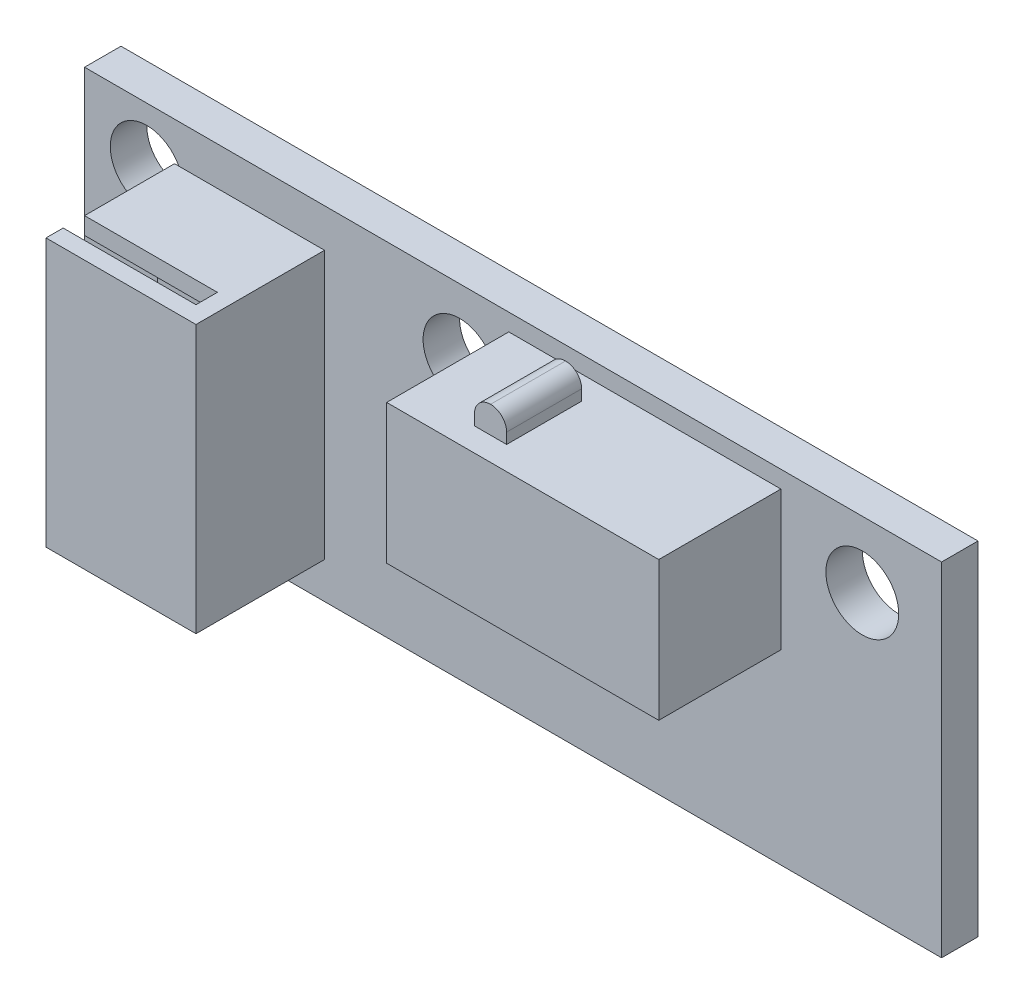
ISO-10303-21;
HEADER;
FILE_DESCRIPTION(('STEP AP214'),'2;1');
FILE_NAME('part.step','',(''),(''),'','','');
FILE_SCHEMA(('AUTOMOTIVE_DESIGN { 1 0 10303 214 1 1 1 1 }'));
ENDSEC;
DATA;
#1=APPLICATION_CONTEXT('core data for automotive mechanical design processes');
#2=APPLICATION_PROTOCOL_DEFINITION('international standard','automotive_design',2000,#1);
#3=PRODUCT_CONTEXT('',#1,'mechanical');
#4=PRODUCT('Part','Part','',(#3));
#5=PRODUCT_RELATED_PRODUCT_CATEGORY('part','',(#4));
#6=PRODUCT_DEFINITION_FORMATION('','',#4);
#7=PRODUCT_DEFINITION_CONTEXT('part definition',#1,'design');
#8=PRODUCT_DEFINITION('design','',#6,#7);
#9=PRODUCT_DEFINITION_SHAPE('','',#8);
#10=(LENGTH_UNIT() NAMED_UNIT(*) SI_UNIT(.MILLI.,.METRE.));
#11=(NAMED_UNIT(*) PLANE_ANGLE_UNIT() SI_UNIT($,.RADIAN.));
#12=(NAMED_UNIT(*) SI_UNIT($,.STERADIAN.) SOLID_ANGLE_UNIT());
#13=UNCERTAINTY_MEASURE_WITH_UNIT(LENGTH_MEASURE(1.E-05),#10,'distance_accuracy_value','');
#14=(GEOMETRIC_REPRESENTATION_CONTEXT(3) GLOBAL_UNCERTAINTY_ASSIGNED_CONTEXT((#13)) GLOBAL_UNIT_ASSIGNED_CONTEXT((#10,
#11,#12)) REPRESENTATION_CONTEXT('',''));
#15=CARTESIAN_POINT('',(0.,0.,0.));
#16=DIRECTION('',(0.,0.,1.));
#17=DIRECTION('',(1.,0.,0.));
#18=AXIS2_PLACEMENT_3D('',#15,#16,#17);
#19=CARTESIAN_POINT('',(-15.8,6.2,7.7));
#20=DIRECTION('',(1.,0.,0.));
#21=DIRECTION('',(0.,0.,-1.));
#22=AXIS2_PLACEMENT_3D('',#19,#20,#21);
#23=PLANE('',#22);
#24=DIRECTION('',(0.,1.,0.));
#25=VECTOR('',#24,1.);
#26=CARTESIAN_POINT('',(-15.8,0.,5.89999999999999));
#27=LINE('',#26,#25);
#28=CARTESIAN_POINT('',(-15.8,5.4,5.9));
#29=VERTEX_POINT('',#28);
#30=CARTESIAN_POINT('',(-15.8,6.2,5.9));
#31=VERTEX_POINT('',#30);
#32=EDGE_CURVE('E162',#29,#31,#27,.T.);
#33=ORIENTED_EDGE('',*,*,#32,.T.);
#34=DIRECTION('',(0.,0.,-1.));
#35=VECTOR('',#34,1.);
#36=CARTESIAN_POINT('',(-15.8,6.2,7.7));
#37=LINE('',#36,#35);
#38=CARTESIAN_POINT('',(-15.8,6.2,1.7));
#39=VERTEX_POINT('',#38);
#40=EDGE_CURVE('E95',#31,#39,#37,.T.);
#41=ORIENTED_EDGE('',*,*,#40,.T.);
#42=DIRECTION('',(0.,-1.,0.));
#43=VECTOR('',#42,1.);
#44=CARTESIAN_POINT('',(-15.8,6.2,1.7));
#45=LINE('',#44,#43);
#46=CARTESIAN_POINT('',(-15.8,-6.3,1.7));
#47=VERTEX_POINT('',#46);
#48=EDGE_CURVE('E194',#39,#47,#45,.T.);
#49=ORIENTED_EDGE('',*,*,#48,.T.);
#50=DIRECTION('',(0.,0.,-1.));
#51=VECTOR('',#50,1.);
#52=CARTESIAN_POINT('',(-15.8,-6.3,7.7));
#53=LINE('',#52,#51);
#54=CARTESIAN_POINT('',(-15.8,-6.3,5.9));
#55=VERTEX_POINT('',#54);
#56=EDGE_CURVE('E57',#55,#47,#53,.T.);
#57=ORIENTED_EDGE('',*,*,#56,.F.);
#58=DIRECTION('',(0.,-1.,0.));
#59=VECTOR('',#58,1.);
#60=CARTESIAN_POINT('',(-15.8,0.,5.9));
#61=LINE('',#60,#59);
#62=CARTESIAN_POINT('',(-15.8,-5.5,5.9));
#63=VERTEX_POINT('',#62);
#64=EDGE_CURVE('E177',#63,#55,#61,.T.);
#65=ORIENTED_EDGE('',*,*,#64,.F.);
#66=DIRECTION('',(0.,0.,1.));
#67=VECTOR('',#66,1.);
#68=CARTESIAN_POINT('',(-15.8,-5.5,0.));
#69=LINE('',#68,#67);
#70=CARTESIAN_POINT('',(-15.8,-5.5,2.5));
#71=VERTEX_POINT('',#70);
#72=EDGE_CURVE('E171',#71,#63,#69,.T.);
#73=ORIENTED_EDGE('',*,*,#72,.F.);
#74=DIRECTION('',(0.,-1.,0.));
#75=VECTOR('',#74,1.);
#76=CARTESIAN_POINT('',(-15.8,0.,2.5));
#77=LINE('',#76,#75);
#78=CARTESIAN_POINT('',(-15.8,5.4,2.5));
#79=VERTEX_POINT('',#78);
#80=EDGE_CURVE('E169',#79,#71,#77,.T.);
#81=ORIENTED_EDGE('',*,*,#80,.F.);
#82=DIRECTION('',(0.,0.,-1.));
#83=VECTOR('',#82,1.);
#84=CARTESIAN_POINT('',(-15.8,5.4,0.));
#85=LINE('',#84,#83);
#86=EDGE_CURVE('E153',#29,#79,#85,.T.);
#87=ORIENTED_EDGE('',*,*,#86,.F.);
#88=EDGE_LOOP('',(#33,#41,#49,#57,#65,#73,#81,#87));
#89=FACE_BOUND('',#88,.T.);
#90=ADVANCED_FACE('F49',(#89),#23,.F.);
#91=CARTESIAN_POINT('',(-15.8,6.2,7.7));
#92=DIRECTION('',(0.,-1.,0.));
#93=DIRECTION('',(0.,0.,-1.));
#94=AXIS2_PLACEMENT_3D('',#91,#92,#93);
#95=PLANE('',#94);
#96=DIRECTION('',(-1.,0.,0.));
#97=VECTOR('',#96,1.);
#98=CARTESIAN_POINT('',(4.45179233160556,6.2,5.9));
#99=LINE('',#98,#97);
#100=CARTESIAN_POINT('',(-9.6,6.2,5.9));
#101=VERTEX_POINT('',#100);
#102=EDGE_CURVE('E165',#101,#31,#99,.T.);
#103=ORIENTED_EDGE('',*,*,#102,.F.);
#104=DIRECTION('',(0.,0.,1.));
#105=VECTOR('',#104,1.);
#106=CARTESIAN_POINT('',(-9.6,6.2,0.));
#107=LINE('',#106,#105);
#108=CARTESIAN_POINT('',(-9.6,6.2,6.9));
#109=VERTEX_POINT('',#108);
#110=EDGE_CURVE('E370',#101,#109,#107,.T.);
#111=ORIENTED_EDGE('',*,*,#110,.T.);
#112=DIRECTION('',(-1.,0.,0.));
#113=VECTOR('',#112,1.);
#114=CARTESIAN_POINT('',(4.45179233160556,6.2,6.9));
#115=LINE('',#114,#113);
#116=CARTESIAN_POINT('',(-15.8,6.2,6.9));
#117=VERTEX_POINT('',#116);
#118=EDGE_CURVE('E64',#109,#117,#115,.T.);
#119=ORIENTED_EDGE('',*,*,#118,.T.);
#120=CARTESIAN_POINT('',(-15.8,6.2,7.7));
#121=VERTEX_POINT('',#120);
#122=EDGE_CURVE('E209',#121,#117,#37,.T.);
#123=ORIENTED_EDGE('',*,*,#122,.F.);
#124=DIRECTION('',(-1.,0.,0.));
#125=VECTOR('',#124,1.);
#126=CARTESIAN_POINT('',(-15.8,6.2,7.7));
#127=LINE('',#126,#125);
#128=CARTESIAN_POINT('',(-8.8,6.2,7.7));
#129=VERTEX_POINT('',#128);
#130=EDGE_CURVE('E73',#129,#121,#127,.T.);
#131=ORIENTED_EDGE('',*,*,#130,.F.);
#132=DIRECTION('',(0.,0.,-1.));
#133=VECTOR('',#132,1.);
#134=CARTESIAN_POINT('',(-8.8,6.2,7.7));
#135=LINE('',#134,#133);
#136=CARTESIAN_POINT('',(-8.8,6.2,1.7));
#137=VERTEX_POINT('',#136);
#138=EDGE_CURVE('E212',#129,#137,#135,.T.);
#139=ORIENTED_EDGE('',*,*,#138,.T.);
#140=DIRECTION('',(-1.,0.,0.));
#141=VECTOR('',#140,1.);
#142=CARTESIAN_POINT('',(-15.8,6.2,1.7));
#143=LINE('',#142,#141);
#144=EDGE_CURVE('E198',#137,#39,#143,.T.);
#145=ORIENTED_EDGE('',*,*,#144,.T.);
#146=ORIENTED_EDGE('',*,*,#40,.F.);
#147=EDGE_LOOP('',(#103,#111,#119,#123,#131,#139,#145,#146));
#148=FACE_BOUND('',#147,.T.);
#149=ADVANCED_FACE('F232',(#148),#95,.F.);
#150=ORIENTED_EDGE('',*,*,#122,.T.);
#151=DIRECTION('',(0.,1.,0.));
#152=VECTOR('',#151,1.);
#153=CARTESIAN_POINT('',(-15.8,0.,6.9));
#154=LINE('',#153,#152);
#155=CARTESIAN_POINT('',(-15.8,-6.3,6.9));
#156=VERTEX_POINT('',#155);
#157=EDGE_CURVE('E160',#156,#117,#154,.T.);
#158=ORIENTED_EDGE('',*,*,#157,.F.);
#159=CARTESIAN_POINT('',(-15.8,-6.3,7.7));
#160=VERTEX_POINT('',#159);
#161=EDGE_CURVE('E13',#160,#156,#53,.T.);
#162=ORIENTED_EDGE('',*,*,#161,.F.);
#163=DIRECTION('',(0.,-1.,0.));
#164=VECTOR('',#163,1.);
#165=CARTESIAN_POINT('',(-15.8,6.2,7.7));
#166=LINE('',#165,#164);
#167=EDGE_CURVE('E196',#121,#160,#166,.T.);
#168=ORIENTED_EDGE('',*,*,#167,.F.);
#169=EDGE_LOOP('',(#150,#158,#162,#168));
#170=FACE_BOUND('',#169,.T.);
#171=ADVANCED_FACE('F51',(#170),#23,.F.);
#172=CARTESIAN_POINT('',(-15.8,-6.3,7.7));
#173=DIRECTION('',(0.,1.,0.));
#174=DIRECTION('',(-1.,0.,0.));
#175=AXIS2_PLACEMENT_3D('',#172,#173,#174);
#176=PLANE('',#175);
#177=ORIENTED_EDGE('',*,*,#161,.T.);
#178=DIRECTION('',(-1.,0.,0.));
#179=VECTOR('',#178,1.);
#180=CARTESIAN_POINT('',(4.45179233160556,-6.3,6.9));
#181=LINE('',#180,#179);
#182=CARTESIAN_POINT('',(-9.6,-6.3,6.9));
#183=VERTEX_POINT('',#182);
#184=EDGE_CURVE('E183',#183,#156,#181,.T.);
#185=ORIENTED_EDGE('',*,*,#184,.F.);
#186=DIRECTION('',(0.,0.,-1.));
#187=VECTOR('',#186,1.);
#188=CARTESIAN_POINT('',(-9.6,-6.3,0.));
#189=LINE('',#188,#187);
#190=CARTESIAN_POINT('',(-9.6,-6.3,5.9));
#191=VERTEX_POINT('',#190);
#192=EDGE_CURVE('E374',#183,#191,#189,.T.);
#193=ORIENTED_EDGE('',*,*,#192,.T.);
#194=DIRECTION('',(-1.,0.,0.));
#195=VECTOR('',#194,1.);
#196=CARTESIAN_POINT('',(4.45179233160556,-6.3,5.9));
#197=LINE('',#196,#195);
#198=EDGE_CURVE('E185',#191,#55,#197,.T.);
#199=ORIENTED_EDGE('',*,*,#198,.T.);
#200=ORIENTED_EDGE('',*,*,#56,.T.);
#201=DIRECTION('',(1.,0.,0.));
#202=VECTOR('',#201,1.);
#203=CARTESIAN_POINT('',(-15.8,-6.3,1.7));
#204=LINE('',#203,#202);
#205=CARTESIAN_POINT('',(-8.8,-6.3,1.7));
#206=VERTEX_POINT('',#205);
#207=EDGE_CURVE('E204',#47,#206,#204,.T.);
#208=ORIENTED_EDGE('',*,*,#207,.T.);
#209=DIRECTION('',(0.,0.,-1.));
#210=VECTOR('',#209,1.);
#211=CARTESIAN_POINT('',(-8.8,-6.3,7.7));
#212=LINE('',#211,#210);
#213=CARTESIAN_POINT('',(-8.8,-6.3,7.7));
#214=VERTEX_POINT('',#213);
#215=EDGE_CURVE('E214',#214,#206,#212,.T.);
#216=ORIENTED_EDGE('',*,*,#215,.F.);
#217=DIRECTION('',(1.,0.,0.));
#218=VECTOR('',#217,1.);
#219=CARTESIAN_POINT('',(-15.8,-6.3,7.7));
#220=LINE('',#219,#218);
#221=EDGE_CURVE('E102',#160,#214,#220,.T.);
#222=ORIENTED_EDGE('',*,*,#221,.F.);
#223=EDGE_LOOP('',(#177,#185,#193,#199,#200,#208,#216,#222));
#224=FACE_BOUND('',#223,.T.);
#225=ADVANCED_FACE('F221',(#224),#176,.F.);
#226=CARTESIAN_POINT('',(-8.8,6.2,7.7));
#227=DIRECTION('',(-1.,0.,0.));
#228=DIRECTION('',(0.,-1.,0.));
#229=AXIS2_PLACEMENT_3D('',#226,#227,#228);
#230=PLANE('',#229);
#231=DIRECTION('',(0.,1.,0.));
#232=VECTOR('',#231,1.);
#233=CARTESIAN_POINT('',(-8.8,6.2,1.7));
#234=LINE('',#233,#232);
#235=EDGE_CURVE('E206',#206,#137,#234,.T.);
#236=ORIENTED_EDGE('',*,*,#235,.T.);
#237=ORIENTED_EDGE('',*,*,#138,.F.);
#238=DIRECTION('',(0.,1.,0.));
#239=VECTOR('',#238,1.);
#240=CARTESIAN_POINT('',(-8.8,6.2,7.7));
#241=LINE('',#240,#239);
#242=EDGE_CURVE('E200',#214,#129,#241,.T.);
#243=ORIENTED_EDGE('',*,*,#242,.F.);
#244=ORIENTED_EDGE('',*,*,#215,.T.);
#245=EDGE_LOOP('',(#236,#237,#243,#244));
#246=FACE_BOUND('',#245,.T.);
#247=ADVANCED_FACE('F230',(#246),#230,.F.);
#248=CARTESIAN_POINT('',(0.,0.,7.7));
#249=DIRECTION('',(0.,0.,1.));
#250=DIRECTION('',(1.,0.,0.));
#251=AXIS2_PLACEMENT_3D('',#248,#249,#250);
#252=PLANE('',#251);
#253=ORIENTED_EDGE('',*,*,#167,.T.);
#254=ORIENTED_EDGE('',*,*,#221,.T.);
#255=ORIENTED_EDGE('',*,*,#242,.T.);
#256=ORIENTED_EDGE('',*,*,#130,.T.);
#257=EDGE_LOOP('',(#253,#254,#255,#256));
#258=FACE_BOUND('',#257,.T.);
#259=ADVANCED_FACE('F238',(#258),#252,.T.);
#260=CARTESIAN_POINT('',(0.,0.,1.7));
#261=DIRECTION('',(0.,0.,1.));
#262=DIRECTION('',(1.,0.,0.));
#263=AXIS2_PLACEMENT_3D('',#260,#261,#262);
#264=PLANE('',#263);
#265=ORIENTED_EDGE('',*,*,#48,.F.);
#266=ORIENTED_EDGE('',*,*,#144,.F.);
#267=ORIENTED_EDGE('',*,*,#235,.F.);
#268=ORIENTED_EDGE('',*,*,#207,.F.);
#269=EDGE_LOOP('',(#265,#266,#267,#268));
#270=FACE_BOUND('',#269,.T.);
#271=ADVANCED_FACE('F227',(#270),#264,.F.);
#272=CARTESIAN_POINT('',(4.45179233160556,0.,5.89999999999999));
#273=DIRECTION('',(0.,0.,1.));
#274=DIRECTION('',(0.,-1.,0.));
#275=AXIS2_PLACEMENT_3D('',#272,#273,#274);
#276=PLANE('',#275);
#277=ORIENTED_EDGE('',*,*,#102,.T.);
#278=ORIENTED_EDGE('',*,*,#32,.F.);
#279=DIRECTION('',(-1.,0.,0.));
#280=VECTOR('',#279,1.);
#281=CARTESIAN_POINT('',(4.45179233160556,5.4,5.9));
#282=LINE('',#281,#280);
#283=CARTESIAN_POINT('',(-9.6,5.4,5.9));
#284=VERTEX_POINT('',#283);
#285=EDGE_CURVE('E148',#284,#29,#282,.T.);
#286=ORIENTED_EDGE('',*,*,#285,.F.);
#287=DIRECTION('',(0.,-1.,0.));
#288=VECTOR('',#287,1.);
#289=CARTESIAN_POINT('',(-9.6,0.,5.89999999999999));
#290=LINE('',#289,#288);
#291=EDGE_CURVE('E195',#101,#284,#290,.T.);
#292=ORIENTED_EDGE('',*,*,#291,.F.);
#293=EDGE_LOOP('',(#277,#278,#286,#292));
#294=FACE_BOUND('',#293,.T.);
#295=ADVANCED_FACE('F163',(#294),#276,.T.);
#296=CARTESIAN_POINT('',(4.45179233160556,0.,6.9));
#297=DIRECTION('',(0.,0.,1.));
#298=DIRECTION('',(1.,0.,0.));
#299=AXIS2_PLACEMENT_3D('',#296,#297,#298);
#300=PLANE('',#299);
#301=DIRECTION('',(0.,-1.,0.));
#302=VECTOR('',#301,1.);
#303=CARTESIAN_POINT('',(-9.6,0.,6.9));
#304=LINE('',#303,#302);
#305=EDGE_CURVE('E372',#109,#183,#304,.T.);
#306=ORIENTED_EDGE('',*,*,#305,.T.);
#307=ORIENTED_EDGE('',*,*,#184,.T.);
#308=ORIENTED_EDGE('',*,*,#157,.T.);
#309=ORIENTED_EDGE('',*,*,#118,.F.);
#310=EDGE_LOOP('',(#306,#307,#308,#309));
#311=FACE_BOUND('',#310,.T.);
#312=ADVANCED_FACE('F299',(#311),#300,.F.);
#313=CARTESIAN_POINT('',(4.45179233160556,0.,5.9));
#314=DIRECTION('',(0.,0.,-1.));
#315=DIRECTION('',(-1.,0.,0.));
#316=AXIS2_PLACEMENT_3D('',#313,#314,#315);
#317=PLANE('',#316);
#318=DIRECTION('',(0.,1.,0.));
#319=VECTOR('',#318,1.);
#320=CARTESIAN_POINT('',(-9.6,0.,5.9));
#321=LINE('',#320,#319);
#322=CARTESIAN_POINT('',(-9.6,-5.5,5.9));
#323=VERTEX_POINT('',#322);
#324=EDGE_CURVE('E378',#191,#323,#321,.T.);
#325=ORIENTED_EDGE('',*,*,#324,.T.);
#326=DIRECTION('',(-1.,0.,0.));
#327=VECTOR('',#326,1.);
#328=CARTESIAN_POINT('',(4.45179233160556,-5.5,5.9));
#329=LINE('',#328,#327);
#330=EDGE_CURVE('E188',#323,#63,#329,.T.);
#331=ORIENTED_EDGE('',*,*,#330,.T.);
#332=ORIENTED_EDGE('',*,*,#64,.T.);
#333=ORIENTED_EDGE('',*,*,#198,.F.);
#334=EDGE_LOOP('',(#325,#331,#332,#333));
#335=FACE_BOUND('',#334,.T.);
#336=ADVANCED_FACE('F306',(#335),#317,.F.);
#337=CARTESIAN_POINT('',(4.45179233160556,-5.5,0.));
#338=DIRECTION('',(0.,-1.,0.));
#339=DIRECTION('',(0.,0.,-1.));
#340=AXIS2_PLACEMENT_3D('',#337,#338,#339);
#341=PLANE('',#340);
#342=DIRECTION('',(0.,0.,-1.));
#343=VECTOR('',#342,1.);
#344=CARTESIAN_POINT('',(-9.6,-5.5,0.));
#345=LINE('',#344,#343);
#346=CARTESIAN_POINT('',(-9.6,-5.5,2.5));
#347=VERTEX_POINT('',#346);
#348=EDGE_CURVE('E380',#323,#347,#345,.T.);
#349=ORIENTED_EDGE('',*,*,#348,.T.);
#350=DIRECTION('',(-1.,0.,0.));
#351=VECTOR('',#350,1.);
#352=CARTESIAN_POINT('',(4.45179233160556,-5.5,2.5));
#353=LINE('',#352,#351);
#354=EDGE_CURVE('E190',#347,#71,#353,.T.);
#355=ORIENTED_EDGE('',*,*,#354,.T.);
#356=ORIENTED_EDGE('',*,*,#72,.T.);
#357=ORIENTED_EDGE('',*,*,#330,.F.);
#358=EDGE_LOOP('',(#349,#355,#356,#357));
#359=FACE_BOUND('',#358,.T.);
#360=ADVANCED_FACE('F320',(#359),#341,.F.);
#361=CARTESIAN_POINT('',(4.45179233160556,0.,2.5));
#362=DIRECTION('',(0.,0.,-1.));
#363=DIRECTION('',(-1.,0.,0.));
#364=AXIS2_PLACEMENT_3D('',#361,#362,#363);
#365=PLANE('',#364);
#366=DIRECTION('',(0.,1.,0.));
#367=VECTOR('',#366,1.);
#368=CARTESIAN_POINT('',(-9.6,0.,2.5));
#369=LINE('',#368,#367);
#370=CARTESIAN_POINT('',(-9.6,5.4,2.5));
#371=VERTEX_POINT('',#370);
#372=EDGE_CURVE('E181',#347,#371,#369,.T.);
#373=ORIENTED_EDGE('',*,*,#372,.T.);
#374=DIRECTION('',(-1.,0.,0.));
#375=VECTOR('',#374,1.);
#376=CARTESIAN_POINT('',(4.45179233160556,5.4,2.5));
#377=LINE('',#376,#375);
#378=EDGE_CURVE('E159',#371,#79,#377,.T.);
#379=ORIENTED_EDGE('',*,*,#378,.T.);
#380=ORIENTED_EDGE('',*,*,#80,.T.);
#381=ORIENTED_EDGE('',*,*,#354,.F.);
#382=EDGE_LOOP('',(#373,#379,#380,#381));
#383=FACE_BOUND('',#382,.T.);
#384=ADVANCED_FACE('F329',(#383),#365,.F.);
#385=CARTESIAN_POINT('',(4.45179233160556,5.4,0.));
#386=DIRECTION('',(0.,1.,0.));
#387=DIRECTION('',(0.,0.,1.));
#388=AXIS2_PLACEMENT_3D('',#385,#386,#387);
#389=PLANE('',#388);
#390=DIRECTION('',(0.,0.,1.));
#391=VECTOR('',#390,1.);
#392=CARTESIAN_POINT('',(-9.6,5.4,0.));
#393=LINE('',#392,#391);
#394=EDGE_CURVE('E156',#371,#284,#393,.T.);
#395=ORIENTED_EDGE('',*,*,#394,.T.);
#396=ORIENTED_EDGE('',*,*,#285,.T.);
#397=ORIENTED_EDGE('',*,*,#86,.T.);
#398=ORIENTED_EDGE('',*,*,#378,.F.);
#399=EDGE_LOOP('',(#395,#396,#397,#398));
#400=FACE_BOUND('',#399,.T.);
#401=ADVANCED_FACE('F150',(#400),#389,.F.);
#402=CARTESIAN_POINT('',(-9.6,6.2,7.7));
#403=DIRECTION('',(-1.,0.,0.));
#404=DIRECTION('',(0.,-1.,0.));
#405=AXIS2_PLACEMENT_3D('',#402,#403,#404);
#406=PLANE('',#405);
#407=ORIENTED_EDGE('',*,*,#110,.F.);
#408=ORIENTED_EDGE('',*,*,#291,.T.);
#409=ORIENTED_EDGE('',*,*,#394,.F.);
#410=ORIENTED_EDGE('',*,*,#372,.F.);
#411=ORIENTED_EDGE('',*,*,#348,.F.);
#412=ORIENTED_EDGE('',*,*,#324,.F.);
#413=ORIENTED_EDGE('',*,*,#192,.F.);
#414=ORIENTED_EDGE('',*,*,#305,.F.);
#415=EDGE_LOOP('',(#407,#408,#409,#410,#411,#412,#413,#414));
#416=FACE_BOUND('',#415,.T.);
#417=ADVANCED_FACE('F349',(#416),#406,.T.);
#418=CLOSED_SHELL('',(#90,#149,#171,#225,#247,#259,#271,#295,#312,#336,#360,#384,#401,#417));
#419=MANIFOLD_SOLID_BREP('B2',#418);
#420=CARTESIAN_POINT('',(4.3,8.45,0.));
#421=DIRECTION('',(1.,0.,0.));
#422=DIRECTION('',(0.,1.,0.));
#423=AXIS2_PLACEMENT_3D('',#420,#421,#422);
#424=PLANE('',#423);
#425=DIRECTION('',(0.,-1.,0.));
#426=VECTOR('',#425,1.);
#427=CARTESIAN_POINT('',(4.3,8.45,2.8));
#428=LINE('',#427,#426);
#429=CARTESIAN_POINT('',(4.3,7.7,2.8));
#430=VERTEX_POINT('',#429);
#431=CARTESIAN_POINT('',(4.3,7.2,2.8));
#432=VERTEX_POINT('',#431);
#433=EDGE_CURVE('E444',#430,#432,#428,.T.);
#434=ORIENTED_EDGE('',*,*,#433,.F.);
#435=DIRECTION('',(0.,0.,1.));
#436=VECTOR('',#435,1.);
#437=CARTESIAN_POINT('',(4.3,7.7,0.));
#438=LINE('',#437,#436);
#439=CARTESIAN_POINT('',(4.3,7.7,6.3));
#440=VERTEX_POINT('',#439);
#441=EDGE_CURVE('E453',#430,#440,#438,.T.);
#442=ORIENTED_EDGE('',*,*,#441,.T.);
#443=DIRECTION('',(0.,-1.,0.));
#444=VECTOR('',#443,1.);
#445=CARTESIAN_POINT('',(4.3,8.45,6.3));
#446=LINE('',#445,#444);
#447=CARTESIAN_POINT('',(4.3,7.2,6.3));
#448=VERTEX_POINT('',#447);
#449=EDGE_CURVE('E459',#440,#448,#446,.T.);
#450=ORIENTED_EDGE('',*,*,#449,.T.);
#451=DIRECTION('',(0.,0.,1.));
#452=VECTOR('',#451,1.);
#453=CARTESIAN_POINT('',(4.3,7.2,0.));
#454=LINE('',#453,#452);
#455=EDGE_CURVE('E457',#432,#448,#454,.T.);
#456=ORIENTED_EDGE('',*,*,#455,.F.);
#457=EDGE_LOOP('',(#434,#442,#450,#456));
#458=FACE_BOUND('',#457,.T.);
#459=ADVANCED_FACE('F398',(#458),#424,.T.);
#460=CARTESIAN_POINT('',(0.,8.45,2.8));
#461=DIRECTION('',(0.,0.,-1.));
#462=DIRECTION('',(-1.,0.,0.));
#463=AXIS2_PLACEMENT_3D('',#460,#461,#462);
#464=PLANE('',#463);
#465=CARTESIAN_POINT('',(3.55,7.7,2.8));
#466=DIRECTION('',(0.,0.,-1.));
#467=DIRECTION('',(-1.,0.,0.));
#468=AXIS2_PLACEMENT_3D('',#465,#466,#467);
#469=CIRCLE('',#468,0.75);
#470=CARTESIAN_POINT('',(2.8,7.7,2.8));
#471=VERTEX_POINT('',#470);
#472=CARTESIAN_POINT('',(3.55,8.45,2.8));
#473=VERTEX_POINT('',#472);
#474=EDGE_CURVE('E414',#471,#473,#469,.T.);
#475=ORIENTED_EDGE('',*,*,#474,.T.);
#476=CARTESIAN_POINT('',(3.55,7.7,2.8));
#477=DIRECTION('',(0.,0.,-1.));
#478=DIRECTION('',(-1.,0.,0.));
#479=AXIS2_PLACEMENT_3D('',#476,#477,#478);
#480=CIRCLE('',#479,0.75);
#481=EDGE_CURVE('E407',#473,#430,#480,.T.);
#482=ORIENTED_EDGE('',*,*,#481,.T.);
#483=ORIENTED_EDGE('',*,*,#433,.T.);
#484=DIRECTION('',(1.,0.,0.));
#485=VECTOR('',#484,1.);
#486=CARTESIAN_POINT('',(0.,7.2,2.8));
#487=LINE('',#486,#485);
#488=CARTESIAN_POINT('',(2.8,7.2,2.8));
#489=VERTEX_POINT('',#488);
#490=EDGE_CURVE('E448',#489,#432,#487,.T.);
#491=ORIENTED_EDGE('',*,*,#490,.F.);
#492=DIRECTION('',(0.,-1.,0.));
#493=VECTOR('',#492,1.);
#494=CARTESIAN_POINT('',(2.8,8.45,2.8));
#495=LINE('',#494,#493);
#496=EDGE_CURVE('E454',#471,#489,#495,.T.);
#497=ORIENTED_EDGE('',*,*,#496,.F.);
#498=EDGE_LOOP('',(#475,#482,#483,#491,#497));
#499=FACE_BOUND('',#498,.T.);
#500=ADVANCED_FACE('F446',(#499),#464,.T.);
#501=CARTESIAN_POINT('',(2.8,8.45,0.));
#502=DIRECTION('',(1.,0.,0.));
#503=DIRECTION('',(0.,1.,0.));
#504=AXIS2_PLACEMENT_3D('',#501,#502,#503);
#505=PLANE('',#504);
#506=DIRECTION('',(0.,-1.,0.));
#507=VECTOR('',#506,1.);
#508=CARTESIAN_POINT('',(2.8,8.45,6.3));
#509=LINE('',#508,#507);
#510=CARTESIAN_POINT('',(2.8,7.7,6.3));
#511=VERTEX_POINT('',#510);
#512=CARTESIAN_POINT('',(2.8,7.2,6.3));
#513=VERTEX_POINT('',#512);
#514=EDGE_CURVE('E474',#511,#513,#509,.T.);
#515=ORIENTED_EDGE('',*,*,#514,.F.);
#516=DIRECTION('',(0.,0.,1.));
#517=VECTOR('',#516,1.);
#518=CARTESIAN_POINT('',(2.8,7.7,2.8));
#519=LINE('',#518,#517);
#520=EDGE_CURVE('E47',#511,#471,#519,.F.);
#521=ORIENTED_EDGE('',*,*,#520,.T.);
#522=ORIENTED_EDGE('',*,*,#496,.T.);
#523=DIRECTION('',(0.,0.,1.));
#524=VECTOR('',#523,1.);
#525=CARTESIAN_POINT('',(2.8,7.2,0.));
#526=LINE('',#525,#524);
#527=EDGE_CURVE('E467',#489,#513,#526,.T.);
#528=ORIENTED_EDGE('',*,*,#527,.T.);
#529=EDGE_LOOP('',(#515,#521,#522,#528));
#530=FACE_BOUND('',#529,.T.);
#531=ADVANCED_FACE('F499',(#530),#505,.F.);
#532=CARTESIAN_POINT('',(0.,8.45,6.3));
#533=DIRECTION('',(0.,0.,-1.));
#534=DIRECTION('',(-1.,0.,0.));
#535=AXIS2_PLACEMENT_3D('',#532,#533,#534);
#536=PLANE('',#535);
#537=ORIENTED_EDGE('',*,*,#449,.F.);
#538=CARTESIAN_POINT('',(3.55,7.7,6.3));
#539=DIRECTION('',(0.,0.,-1.));
#540=DIRECTION('',(-1.,0.,0.));
#541=AXIS2_PLACEMENT_3D('',#538,#539,#540);
#542=CIRCLE('',#541,0.75);
#543=CARTESIAN_POINT('',(3.55,8.45,6.3));
#544=VERTEX_POINT('',#543);
#545=EDGE_CURVE('E480',#440,#544,#542,.F.);
#546=ORIENTED_EDGE('',*,*,#545,.T.);
#547=CARTESIAN_POINT('',(3.55,7.7,6.3));
#548=DIRECTION('',(0.,0.,-1.));
#549=DIRECTION('',(-1.,0.,0.));
#550=AXIS2_PLACEMENT_3D('',#547,#548,#549);
#551=CIRCLE('',#550,0.75);
#552=EDGE_CURVE('E478',#544,#511,#551,.F.);
#553=ORIENTED_EDGE('',*,*,#552,.T.);
#554=ORIENTED_EDGE('',*,*,#514,.T.);
#555=DIRECTION('',(1.,0.,0.));
#556=VECTOR('',#555,1.);
#557=CARTESIAN_POINT('',(0.,7.2,6.3));
#558=LINE('',#557,#556);
#559=EDGE_CURVE('E469',#513,#448,#558,.T.);
#560=ORIENTED_EDGE('',*,*,#559,.T.);
#561=EDGE_LOOP('',(#537,#546,#553,#554,#560));
#562=FACE_BOUND('',#561,.T.);
#563=ADVANCED_FACE('F485',(#562),#536,.F.);
#564=CARTESIAN_POINT('',(0.,7.2,0.));
#565=DIRECTION('',(0.,1.,0.));
#566=DIRECTION('',(-1.,0.,0.));
#567=AXIS2_PLACEMENT_3D('',#564,#565,#566);
#568=PLANE('',#567);
#569=ORIENTED_EDGE('',*,*,#455,.T.);
#570=ORIENTED_EDGE('',*,*,#559,.F.);
#571=ORIENTED_EDGE('',*,*,#527,.F.);
#572=ORIENTED_EDGE('',*,*,#490,.T.);
#573=EDGE_LOOP('',(#569,#570,#571,#572));
#574=FACE_BOUND('',#573,.T.);
#575=ADVANCED_FACE('F465',(#574),#568,.F.);
#576=CARTESIAN_POINT('',(3.55,7.7,0.));
#577=DIRECTION('',(0.,0.,-1.));
#578=DIRECTION('',(-1.,0.,0.));
#579=AXIS2_PLACEMENT_3D('',#576,#577,#578);
#580=CYLINDRICAL_SURFACE('',#579,0.75);
#581=DIRECTION('',(0.,0.,1.));
#582=VECTOR('',#581,1.);
#583=CARTESIAN_POINT('',(3.55,8.45,6.3));
#584=LINE('',#583,#582);
#585=EDGE_CURVE('E402',#473,#544,#584,.T.);
#586=ORIENTED_EDGE('',*,*,#585,.F.);
#587=ORIENTED_EDGE('',*,*,#474,.F.);
#588=ORIENTED_EDGE('',*,*,#520,.F.);
#589=ORIENTED_EDGE('',*,*,#552,.F.);
#590=EDGE_LOOP('',(#586,#587,#588,#589));
#591=FACE_BOUND('',#590,.T.);
#592=ADVANCED_FACE('F400',(#591),#580,.T.);
#593=CARTESIAN_POINT('',(3.55,7.7,0.));
#594=DIRECTION('',(0.,0.,1.));
#595=DIRECTION('',(1.,0.,0.));
#596=AXIS2_PLACEMENT_3D('',#593,#594,#595);
#597=CYLINDRICAL_SURFACE('',#596,0.75);
#598=ORIENTED_EDGE('',*,*,#481,.F.);
#599=ORIENTED_EDGE('',*,*,#585,.T.);
#600=ORIENTED_EDGE('',*,*,#545,.F.);
#601=ORIENTED_EDGE('',*,*,#441,.F.);
#602=EDGE_LOOP('',(#598,#599,#600,#601));
#603=FACE_BOUND('',#602,.T.);
#604=ADVANCED_FACE('F489',(#603),#597,.T.);
#605=CLOSED_SHELL('',(#459,#500,#531,#563,#575,#592,#604));
#606=MANIFOLD_SOLID_BREP('B7',#605);
#607=CARTESIAN_POINT('',(0.,0.,0.));
#608=DIRECTION('',(0.,0.,-1.));
#609=DIRECTION('',(-1.,0.,0.));
#610=AXIS2_PLACEMENT_3D('',#607,#608,#609);
#611=PLANE('',#610);
#612=CARTESIAN_POINT('',(-17.1,-5.4,0.));
#613=DIRECTION('',(0.,0.,1.));
#614=DIRECTION('',(1.,0.,0.));
#615=AXIS2_PLACEMENT_3D('',#612,#613,#614);
#616=CIRCLE('',#615,1.69999999999999);
#617=CARTESIAN_POINT('',(-15.4,-5.4,0.));
#618=VERTEX_POINT('',#617);
#619=EDGE_CURVE('E651',#618,#618,#616,.T.);
#620=ORIENTED_EDGE('',*,*,#619,.T.);
#621=EDGE_LOOP('',(#620));
#622=FACE_BOUND('',#621,.T.);
#623=CARTESIAN_POINT('',(-2.5,4.9,0.));
#624=DIRECTION('',(0.,0.,1.));
#625=DIRECTION('',(1.,0.,0.));
#626=AXIS2_PLACEMENT_3D('',#623,#624,#625);
#627=CIRCLE('',#626,1.7);
#628=CARTESIAN_POINT('',(-0.800000000000003,4.9,0.));
#629=VERTEX_POINT('',#628);
#630=EDGE_CURVE('E657',#629,#629,#627,.T.);
#631=ORIENTED_EDGE('',*,*,#630,.T.);
#632=EDGE_LOOP('',(#631));
#633=FACE_BOUND('',#632,.T.);
#634=DIRECTION('',(0.,1.,0.));
#635=VECTOR('',#634,1.);
#636=CARTESIAN_POINT('',(20.,-8.,0.));
#637=LINE('',#636,#635);
#638=CARTESIAN_POINT('',(20.,-8.,0.));
#639=VERTEX_POINT('',#638);
#640=CARTESIAN_POINT('',(20.,8.,0.));
#641=VERTEX_POINT('',#640);
#642=EDGE_CURVE('E672',#639,#641,#637,.T.);
#643=ORIENTED_EDGE('',*,*,#642,.F.);
#644=DIRECTION('',(1.,0.,0.));
#645=VECTOR('',#644,1.);
#646=CARTESIAN_POINT('',(-20.,-8.,0.));
#647=LINE('',#646,#645);
#648=CARTESIAN_POINT('',(-20.,-8.,0.));
#649=VERTEX_POINT('',#648);
#650=EDGE_CURVE('E677',#649,#639,#647,.T.);
#651=ORIENTED_EDGE('',*,*,#650,.F.);
#652=DIRECTION('',(0.,-1.,0.));
#653=VECTOR('',#652,1.);
#654=CARTESIAN_POINT('',(-20.,-8.,0.));
#655=LINE('',#654,#653);
#656=CARTESIAN_POINT('',(-20.,8.,0.));
#657=VERTEX_POINT('',#656);
#658=EDGE_CURVE('E688',#657,#649,#655,.T.);
#659=ORIENTED_EDGE('',*,*,#658,.F.);
#660=DIRECTION('',(-1.,0.,0.));
#661=VECTOR('',#660,1.);
#662=CARTESIAN_POINT('',(-20.,8.,0.));
#663=LINE('',#662,#661);
#664=EDGE_CURVE('E686',#641,#657,#663,.T.);
#665=ORIENTED_EDGE('',*,*,#664,.F.);
#666=EDGE_LOOP('',(#643,#651,#659,#665));
#667=FACE_BOUND('',#666,.T.);
#668=CARTESIAN_POINT('',(-17.1,5.4,0.));
#669=DIRECTION('',(0.,0.,1.));
#670=DIRECTION('',(1.,0.,0.));
#671=AXIS2_PLACEMENT_3D('',#668,#669,#670);
#672=CIRCLE('',#671,1.69999999999999);
#673=CARTESIAN_POINT('',(-15.4,5.4,0.));
#674=VERTEX_POINT('',#673);
#675=EDGE_CURVE('E669',#674,#674,#672,.T.);
#676=ORIENTED_EDGE('',*,*,#675,.T.);
#677=EDGE_LOOP('',(#676));
#678=FACE_BOUND('',#677,.T.);
#679=CARTESIAN_POINT('',(16.3,4.9,0.));
#680=DIRECTION('',(0.,0.,1.));
#681=DIRECTION('',(1.,0.,0.));
#682=AXIS2_PLACEMENT_3D('',#679,#680,#681);
#683=CIRCLE('',#682,1.7);
#684=CARTESIAN_POINT('',(18.,4.9,0.));
#685=VERTEX_POINT('',#684);
#686=EDGE_CURVE('E663',#685,#685,#683,.T.);
#687=ORIENTED_EDGE('',*,*,#686,.T.);
#688=EDGE_LOOP('',(#687));
#689=FACE_BOUND('',#688,.T.);
#690=ADVANCED_FACE('F547',(#622,#633,#667,#678,#689),#611,.T.);
#691=CARTESIAN_POINT('',(20.,-8.,1.7));
#692=DIRECTION('',(-1.,0.,0.));
#693=DIRECTION('',(0.,0.,1.));
#694=AXIS2_PLACEMENT_3D('',#691,#692,#693);
#695=PLANE('',#694);
#696=ORIENTED_EDGE('',*,*,#642,.T.);
#697=DIRECTION('',(0.,0.,-1.));
#698=VECTOR('',#697,1.);
#699=CARTESIAN_POINT('',(20.,8.,1.7));
#700=LINE('',#699,#698);
#701=CARTESIAN_POINT('',(20.,8.,1.7));
#702=VERTEX_POINT('',#701);
#703=EDGE_CURVE('E396',#702,#641,#700,.T.);
#704=ORIENTED_EDGE('',*,*,#703,.F.);
#705=DIRECTION('',(0.,1.,0.));
#706=VECTOR('',#705,1.);
#707=CARTESIAN_POINT('',(20.,-8.,1.7));
#708=LINE('',#707,#706);
#709=CARTESIAN_POINT('',(20.,-8.,1.7));
#710=VERTEX_POINT('',#709);
#711=EDGE_CURVE('E673',#710,#702,#708,.T.);
#712=ORIENTED_EDGE('',*,*,#711,.F.);
#713=DIRECTION('',(0.,0.,-1.));
#714=VECTOR('',#713,1.);
#715=CARTESIAN_POINT('',(20.,-8.,1.7));
#716=LINE('',#715,#714);
#717=EDGE_CURVE('E683',#710,#639,#716,.T.);
#718=ORIENTED_EDGE('',*,*,#717,.T.);
#719=EDGE_LOOP('',(#696,#704,#712,#718));
#720=FACE_BOUND('',#719,.T.);
#721=ADVANCED_FACE('F549',(#720),#695,.F.);
#722=CARTESIAN_POINT('',(-20.,8.,1.7));
#723=DIRECTION('',(0.,-1.,0.));
#724=DIRECTION('',(0.,0.,-1.));
#725=AXIS2_PLACEMENT_3D('',#722,#723,#724);
#726=PLANE('',#725);
#727=ORIENTED_EDGE('',*,*,#664,.T.);
#728=DIRECTION('',(0.,0.,-1.));
#729=VECTOR('',#728,1.);
#730=CARTESIAN_POINT('',(-20.,8.,1.7));
#731=LINE('',#730,#729);
#732=CARTESIAN_POINT('',(-20.,8.,1.7));
#733=VERTEX_POINT('',#732);
#734=EDGE_CURVE('E555',#733,#657,#731,.T.);
#735=ORIENTED_EDGE('',*,*,#734,.F.);
#736=DIRECTION('',(-1.,0.,0.));
#737=VECTOR('',#736,1.);
#738=CARTESIAN_POINT('',(-20.,8.,1.7));
#739=LINE('',#738,#737);
#740=EDGE_CURVE('E676',#702,#733,#739,.T.);
#741=ORIENTED_EDGE('',*,*,#740,.F.);
#742=ORIENTED_EDGE('',*,*,#703,.T.);
#743=EDGE_LOOP('',(#727,#735,#741,#742));
#744=FACE_BOUND('',#743,.T.);
#745=ADVANCED_FACE('F716',(#744),#726,.F.);
#746=CARTESIAN_POINT('',(-20.,-8.,1.7));
#747=DIRECTION('',(1.,0.,0.));
#748=DIRECTION('',(0.,0.,-1.));
#749=AXIS2_PLACEMENT_3D('',#746,#747,#748);
#750=PLANE('',#749);
#751=ORIENTED_EDGE('',*,*,#658,.T.);
#752=DIRECTION('',(0.,0.,-1.));
#753=VECTOR('',#752,1.);
#754=CARTESIAN_POINT('',(-20.,-8.,1.7));
#755=LINE('',#754,#753);
#756=CARTESIAN_POINT('',(-20.,-8.,1.7));
#757=VERTEX_POINT('',#756);
#758=EDGE_CURVE('E693',#757,#649,#755,.T.);
#759=ORIENTED_EDGE('',*,*,#758,.F.);
#760=DIRECTION('',(0.,-1.,0.));
#761=VECTOR('',#760,1.);
#762=CARTESIAN_POINT('',(-20.,-8.,1.7));
#763=LINE('',#762,#761);
#764=EDGE_CURVE('E679',#733,#757,#763,.T.);
#765=ORIENTED_EDGE('',*,*,#764,.F.);
#766=ORIENTED_EDGE('',*,*,#734,.T.);
#767=EDGE_LOOP('',(#751,#759,#765,#766));
#768=FACE_BOUND('',#767,.T.);
#769=ADVANCED_FACE('F700',(#768),#750,.F.);
#770=CARTESIAN_POINT('',(-20.,-8.,1.7));
#771=DIRECTION('',(0.,1.,0.));
#772=DIRECTION('',(0.,0.,1.));
#773=AXIS2_PLACEMENT_3D('',#770,#771,#772);
#774=PLANE('',#773);
#775=ORIENTED_EDGE('',*,*,#650,.T.);
#776=ORIENTED_EDGE('',*,*,#717,.F.);
#777=DIRECTION('',(1.,0.,0.));
#778=VECTOR('',#777,1.);
#779=CARTESIAN_POINT('',(-20.,-8.,1.7));
#780=LINE('',#779,#778);
#781=EDGE_CURVE('E681',#757,#710,#780,.T.);
#782=ORIENTED_EDGE('',*,*,#781,.F.);
#783=ORIENTED_EDGE('',*,*,#758,.T.);
#784=EDGE_LOOP('',(#775,#776,#782,#783));
#785=FACE_BOUND('',#784,.T.);
#786=ADVANCED_FACE('F709',(#785),#774,.F.);
#787=CARTESIAN_POINT('',(0.,0.,1.7));
#788=DIRECTION('',(0.,0.,-1.));
#789=DIRECTION('',(-1.,0.,0.));
#790=AXIS2_PLACEMENT_3D('',#787,#788,#789);
#791=PLANE('',#790);
#792=DIRECTION('',(1.,0.,0.));
#793=VECTOR('',#792,1.);
#794=CARTESIAN_POINT('',(0.,7.2,1.7));
#795=LINE('',#794,#793);
#796=CARTESIAN_POINT('',(-0.199999999999999,7.2,1.7));
#797=VERTEX_POINT('',#796);
#798=CARTESIAN_POINT('',(12.5,7.2,1.7));
#799=VERTEX_POINT('',#798);
#800=EDGE_CURVE('E562',#797,#799,#795,.T.);
#801=ORIENTED_EDGE('',*,*,#800,.T.);
#802=DIRECTION('',(0.,-1.,0.));
#803=VECTOR('',#802,1.);
#804=CARTESIAN_POINT('',(12.5,0.,1.7));
#805=LINE('',#804,#803);
#806=CARTESIAN_POINT('',(12.5,0.699999999999998,1.7));
#807=VERTEX_POINT('',#806);
#808=EDGE_CURVE('E616',#799,#807,#805,.T.);
#809=ORIENTED_EDGE('',*,*,#808,.T.);
#810=DIRECTION('',(1.,0.,0.));
#811=VECTOR('',#810,1.);
#812=CARTESIAN_POINT('',(0.,0.699999999999998,1.7));
#813=LINE('',#812,#811);
#814=CARTESIAN_POINT('',(-0.199999999999998,0.699999999999998,1.7));
#815=VERTEX_POINT('',#814);
#816=EDGE_CURVE('E629',#815,#807,#813,.T.);
#817=ORIENTED_EDGE('',*,*,#816,.F.);
#818=DIRECTION('',(0.,-1.,0.));
#819=VECTOR('',#818,1.);
#820=CARTESIAN_POINT('',(-0.199999999999998,0.,1.7));
#821=LINE('',#820,#819);
#822=EDGE_CURVE('E567',#797,#815,#821,.T.);
#823=ORIENTED_EDGE('',*,*,#822,.F.);
#824=EDGE_LOOP('',(#801,#809,#817,#823));
#825=FACE_BOUND('',#824,.T.);
#826=CARTESIAN_POINT('',(-17.1,-5.4,1.7));
#827=DIRECTION('',(0.,0.,1.));
#828=DIRECTION('',(1.,0.,0.));
#829=AXIS2_PLACEMENT_3D('',#826,#827,#828);
#830=CIRCLE('',#829,1.69999999999999);
#831=CARTESIAN_POINT('',(-15.4,-5.4,1.7));
#832=VERTEX_POINT('',#831);
#833=EDGE_CURVE('E619',#832,#832,#830,.T.);
#834=ORIENTED_EDGE('',*,*,#833,.F.);
#835=EDGE_LOOP('',(#834));
#836=FACE_BOUND('',#835,.T.);
#837=CARTESIAN_POINT('',(-2.5,4.9,1.7));
#838=DIRECTION('',(0.,0.,1.));
#839=DIRECTION('',(1.,0.,0.));
#840=AXIS2_PLACEMENT_3D('',#837,#838,#839);
#841=CIRCLE('',#840,1.69999999999999);
#842=CARTESIAN_POINT('',(-0.800000000000011,4.9,1.7));
#843=VERTEX_POINT('',#842);
#844=EDGE_CURVE('E654',#843,#843,#841,.T.);
#845=ORIENTED_EDGE('',*,*,#844,.F.);
#846=EDGE_LOOP('',(#845));
#847=FACE_BOUND('',#846,.T.);
#848=CARTESIAN_POINT('',(16.3,4.9,1.7));
#849=DIRECTION('',(0.,0.,1.));
#850=DIRECTION('',(1.,0.,0.));
#851=AXIS2_PLACEMENT_3D('',#848,#849,#850);
#852=CIRCLE('',#851,1.69999999999999);
#853=CARTESIAN_POINT('',(18.,4.9,1.7));
#854=VERTEX_POINT('',#853);
#855=EDGE_CURVE('E660',#854,#854,#852,.T.);
#856=ORIENTED_EDGE('',*,*,#855,.F.);
#857=EDGE_LOOP('',(#856));
#858=FACE_BOUND('',#857,.T.);
#859=CARTESIAN_POINT('',(-17.1,5.4,1.7));
#860=DIRECTION('',(0.,0.,1.));
#861=DIRECTION('',(1.,0.,0.));
#862=AXIS2_PLACEMENT_3D('',#859,#860,#861);
#863=CIRCLE('',#862,1.69999999999999);
#864=CARTESIAN_POINT('',(-15.4,5.4,1.7));
#865=VERTEX_POINT('',#864);
#866=EDGE_CURVE('E666',#865,#865,#863,.T.);
#867=ORIENTED_EDGE('',*,*,#866,.F.);
#868=EDGE_LOOP('',(#867));
#869=FACE_BOUND('',#868,.T.);
#870=ORIENTED_EDGE('',*,*,#711,.T.);
#871=ORIENTED_EDGE('',*,*,#740,.T.);
#872=ORIENTED_EDGE('',*,*,#764,.T.);
#873=ORIENTED_EDGE('',*,*,#781,.T.);
#874=EDGE_LOOP('',(#870,#871,#872,#873));
#875=FACE_BOUND('',#874,.T.);
#876=ADVANCED_FACE('F715',(#825,#836,#847,#858,#869,#875),#791,.F.);
#877=CARTESIAN_POINT('',(-17.1,5.4,1.7));
#878=DIRECTION('',(0.,0.,1.));
#879=DIRECTION('',(1.,0.,0.));
#880=AXIS2_PLACEMENT_3D('',#877,#878,#879);
#881=CYLINDRICAL_SURFACE('',#880,1.69999999999999);
#882=ORIENTED_EDGE('',*,*,#675,.F.);
#883=EDGE_LOOP('',(#882));
#884=FACE_BOUND('',#883,.T.);
#885=ORIENTED_EDGE('',*,*,#866,.T.);
#886=EDGE_LOOP('',(#885));
#887=FACE_BOUND('',#886,.T.);
#888=ADVANCED_FACE('F736',(#884,#887),#881,.F.);
#889=CARTESIAN_POINT('',(16.3,4.9,1.7));
#890=DIRECTION('',(0.,0.,1.));
#891=DIRECTION('',(1.,0.,0.));
#892=AXIS2_PLACEMENT_3D('',#889,#890,#891);
#893=CYLINDRICAL_SURFACE('',#892,1.69999999999999);
#894=ORIENTED_EDGE('',*,*,#686,.F.);
#895=EDGE_LOOP('',(#894));
#896=FACE_BOUND('',#895,.T.);
#897=ORIENTED_EDGE('',*,*,#855,.T.);
#898=EDGE_LOOP('',(#897));
#899=FACE_BOUND('',#898,.T.);
#900=ADVANCED_FACE('F740',(#896,#899),#893,.F.);
#901=CARTESIAN_POINT('',(-2.5,4.9,1.7));
#902=DIRECTION('',(0.,0.,1.));
#903=DIRECTION('',(1.,0.,0.));
#904=AXIS2_PLACEMENT_3D('',#901,#902,#903);
#905=CYLINDRICAL_SURFACE('',#904,1.69999999999999);
#906=ORIENTED_EDGE('',*,*,#630,.F.);
#907=EDGE_LOOP('',(#906));
#908=FACE_BOUND('',#907,.T.);
#909=ORIENTED_EDGE('',*,*,#844,.T.);
#910=EDGE_LOOP('',(#909));
#911=FACE_BOUND('',#910,.T.);
#912=ADVANCED_FACE('F753',(#908,#911),#905,.F.);
#913=CARTESIAN_POINT('',(-17.1,-5.4,1.7));
#914=DIRECTION('',(0.,0.,1.));
#915=DIRECTION('',(1.,0.,0.));
#916=AXIS2_PLACEMENT_3D('',#913,#914,#915);
#917=CYLINDRICAL_SURFACE('',#916,1.69999999999999);
#918=ORIENTED_EDGE('',*,*,#619,.F.);
#919=EDGE_LOOP('',(#918));
#920=FACE_BOUND('',#919,.T.);
#921=ORIENTED_EDGE('',*,*,#833,.T.);
#922=EDGE_LOOP('',(#921));
#923=FACE_BOUND('',#922,.T.);
#924=ADVANCED_FACE('F759',(#920,#923),#917,.F.);
#925=CARTESIAN_POINT('',(12.5,0.,7.4));
#926=DIRECTION('',(1.,0.,0.));
#927=DIRECTION('',(0.,0.,-1.));
#928=AXIS2_PLACEMENT_3D('',#925,#926,#927);
#929=PLANE('',#928);
#930=ORIENTED_EDGE('',*,*,#808,.F.);
#931=DIRECTION('',(0.,0.,-1.));
#932=VECTOR('',#931,1.);
#933=CARTESIAN_POINT('',(12.5,7.2,7.4));
#934=LINE('',#933,#932);
#935=CARTESIAN_POINT('',(12.5,7.2,7.4));
#936=VERTEX_POINT('',#935);
#937=EDGE_CURVE('E611',#936,#799,#934,.T.);
#938=ORIENTED_EDGE('',*,*,#937,.F.);
#939=DIRECTION('',(0.,-1.,0.));
#940=VECTOR('',#939,1.);
#941=CARTESIAN_POINT('',(12.5,0.,7.4));
#942=LINE('',#941,#940);
#943=CARTESIAN_POINT('',(12.5,0.699999999999998,7.4));
#944=VERTEX_POINT('',#943);
#945=EDGE_CURVE('E615',#936,#944,#942,.T.);
#946=ORIENTED_EDGE('',*,*,#945,.T.);
#947=DIRECTION('',(0.,0.,-1.));
#948=VECTOR('',#947,1.);
#949=CARTESIAN_POINT('',(12.5,0.699999999999998,7.4));
#950=LINE('',#949,#948);
#951=EDGE_CURVE('E638',#944,#807,#950,.T.);
#952=ORIENTED_EDGE('',*,*,#951,.T.);
#953=EDGE_LOOP('',(#930,#938,#946,#952));
#954=FACE_BOUND('',#953,.T.);
#955=ADVANCED_FACE('F613',(#954),#929,.T.);
#956=CARTESIAN_POINT('',(0.,7.2,7.4));
#957=DIRECTION('',(0.,1.,0.));
#958=DIRECTION('',(-1.,0.,0.));
#959=AXIS2_PLACEMENT_3D('',#956,#957,#958);
#960=PLANE('',#959);
#961=ORIENTED_EDGE('',*,*,#800,.F.);
#962=DIRECTION('',(0.,0.,-1.));
#963=VECTOR('',#962,1.);
#964=CARTESIAN_POINT('',(-0.199999999999999,7.2,7.4));
#965=LINE('',#964,#963);
#966=CARTESIAN_POINT('',(-0.199999999999999,7.2,7.4));
#967=VERTEX_POINT('',#966);
#968=EDGE_CURVE('E620',#967,#797,#965,.T.);
#969=ORIENTED_EDGE('',*,*,#968,.F.);
#970=DIRECTION('',(1.,0.,0.));
#971=VECTOR('',#970,1.);
#972=CARTESIAN_POINT('',(0.,7.2,7.4));
#973=LINE('',#972,#971);
#974=EDGE_CURVE('E625',#967,#936,#973,.T.);
#975=ORIENTED_EDGE('',*,*,#974,.T.);
#976=ORIENTED_EDGE('',*,*,#937,.T.);
#977=EDGE_LOOP('',(#961,#969,#975,#976));
#978=FACE_BOUND('',#977,.T.);
#979=ADVANCED_FACE('F631',(#978),#960,.T.);
#980=CARTESIAN_POINT('',(-0.199999999999998,0.,7.4));
#981=DIRECTION('',(1.,0.,0.));
#982=DIRECTION('',(0.,1.,0.));
#983=AXIS2_PLACEMENT_3D('',#980,#981,#982);
#984=PLANE('',#983);
#985=ORIENTED_EDGE('',*,*,#822,.T.);
#986=DIRECTION('',(0.,0.,-1.));
#987=VECTOR('',#986,1.);
#988=CARTESIAN_POINT('',(-0.199999999999998,0.699999999999998,7.4));
#989=LINE('',#988,#987);
#990=CARTESIAN_POINT('',(-0.199999999999998,0.699999999999998,7.4));
#991=VERTEX_POINT('',#990);
#992=EDGE_CURVE('E645',#991,#815,#989,.T.);
#993=ORIENTED_EDGE('',*,*,#992,.F.);
#994=DIRECTION('',(0.,-1.,0.));
#995=VECTOR('',#994,1.);
#996=CARTESIAN_POINT('',(-0.199999999999998,0.,7.4));
#997=LINE('',#996,#995);
#998=EDGE_CURVE('E633',#967,#991,#997,.T.);
#999=ORIENTED_EDGE('',*,*,#998,.F.);
#1000=ORIENTED_EDGE('',*,*,#968,.T.);
#1001=EDGE_LOOP('',(#985,#993,#999,#1000));
#1002=FACE_BOUND('',#1001,.T.);
#1003=ADVANCED_FACE('F771',(#1002),#984,.F.);
#1004=CARTESIAN_POINT('',(0.,0.699999999999998,7.4));
#1005=DIRECTION('',(0.,1.,0.));
#1006=DIRECTION('',(-1.,0.,0.));
#1007=AXIS2_PLACEMENT_3D('',#1004,#1005,#1006);
#1008=PLANE('',#1007);
#1009=ORIENTED_EDGE('',*,*,#816,.T.);
#1010=ORIENTED_EDGE('',*,*,#951,.F.);
#1011=DIRECTION('',(1.,0.,0.));
#1012=VECTOR('',#1011,1.);
#1013=CARTESIAN_POINT('',(0.,0.699999999999998,7.4));
#1014=LINE('',#1013,#1012);
#1015=EDGE_CURVE('E627',#991,#944,#1014,.T.);
#1016=ORIENTED_EDGE('',*,*,#1015,.F.);
#1017=ORIENTED_EDGE('',*,*,#992,.T.);
#1018=EDGE_LOOP('',(#1009,#1010,#1016,#1017));
#1019=FACE_BOUND('',#1018,.T.);
#1020=ADVANCED_FACE('F774',(#1019),#1008,.F.);
#1021=CARTESIAN_POINT('',(0.,0.,7.4));
#1022=DIRECTION('',(0.,0.,1.));
#1023=DIRECTION('',(1.,0.,0.));
#1024=AXIS2_PLACEMENT_3D('',#1021,#1022,#1023);
#1025=PLANE('',#1024);
#1026=ORIENTED_EDGE('',*,*,#945,.F.);
#1027=ORIENTED_EDGE('',*,*,#974,.F.);
#1028=ORIENTED_EDGE('',*,*,#998,.T.);
#1029=ORIENTED_EDGE('',*,*,#1015,.T.);
#1030=EDGE_LOOP('',(#1026,#1027,#1028,#1029));
#1031=FACE_BOUND('',#1030,.T.);
#1032=ADVANCED_FACE('F624',(#1031),#1025,.T.);
#1033=CLOSED_SHELL('',(#690,#721,#745,#769,#786,#876,#888,#900,#912,#924,#955,#979,#1003,#1020,#1032));
#1034=MANIFOLD_SOLID_BREP('B41',#1033);
#1035=ADVANCED_BREP_SHAPE_REPRESENTATION('',(#18,#419,#606,#1034),#14);
#1036=SHAPE_DEFINITION_REPRESENTATION(#9,#1035);
ENDSEC;
END-ISO-10303-21;
